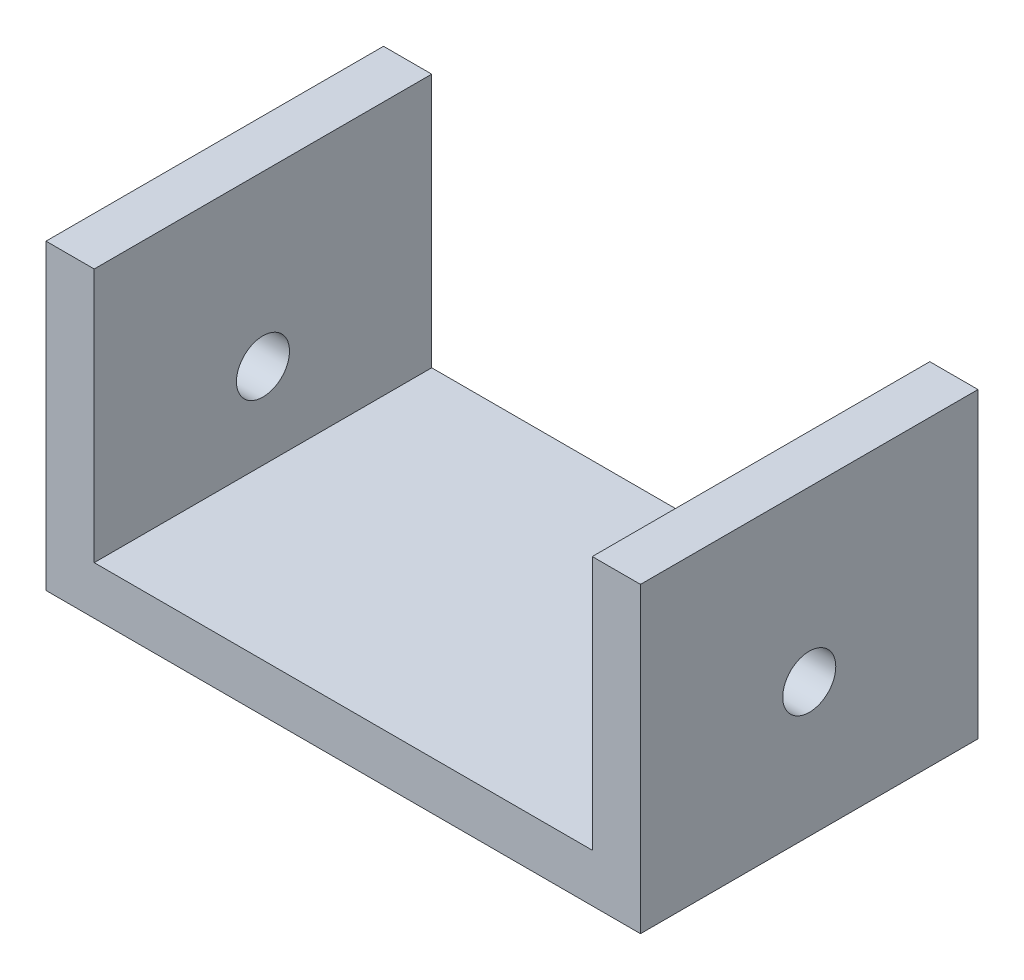
ISO-10303-21;
HEADER;
FILE_DESCRIPTION(('STEP AP214'),'2;1');
FILE_NAME('part.step','',(''),(''),'','','');
FILE_SCHEMA(('AUTOMOTIVE_DESIGN { 1 0 10303 214 1 1 1 1 }'));
ENDSEC;
DATA;
#1=APPLICATION_CONTEXT('core data for automotive mechanical design processes');
#2=APPLICATION_PROTOCOL_DEFINITION('international standard','automotive_design',2000,#1);
#3=PRODUCT_CONTEXT('',#1,'mechanical');
#4=PRODUCT('Part','Part','',(#3));
#5=PRODUCT_RELATED_PRODUCT_CATEGORY('part','',(#4));
#6=PRODUCT_DEFINITION_FORMATION('','',#4);
#7=PRODUCT_DEFINITION_CONTEXT('part definition',#1,'design');
#8=PRODUCT_DEFINITION('design','',#6,#7);
#9=PRODUCT_DEFINITION_SHAPE('','',#8);
#10=(LENGTH_UNIT() NAMED_UNIT(*) SI_UNIT(.MILLI.,.METRE.));
#11=(NAMED_UNIT(*) PLANE_ANGLE_UNIT() SI_UNIT($,.RADIAN.));
#12=(NAMED_UNIT(*) SI_UNIT($,.STERADIAN.) SOLID_ANGLE_UNIT());
#13=UNCERTAINTY_MEASURE_WITH_UNIT(LENGTH_MEASURE(1.E-05),#10,'distance_accuracy_value','');
#14=(GEOMETRIC_REPRESENTATION_CONTEXT(3) GLOBAL_UNCERTAINTY_ASSIGNED_CONTEXT((#13)) GLOBAL_UNIT_ASSIGNED_CONTEXT((#10,
#11,#12)) REPRESENTATION_CONTEXT('',''));
#15=CARTESIAN_POINT('',(0.,0.,0.));
#16=DIRECTION('',(0.,0.,1.));
#17=DIRECTION('',(1.,0.,0.));
#18=AXIS2_PLACEMENT_3D('',#15,#16,#17);
#19=CARTESIAN_POINT('',(-30.825,15.6875,35.));
#20=DIRECTION('',(0.,-1.,0.));
#21=DIRECTION('',(0.,0.,-1.));
#22=AXIS2_PLACEMENT_3D('',#19,#20,#21);
#23=PLANE('',#22);
#24=DIRECTION('',(-1.,0.,0.));
#25=VECTOR('',#24,1.);
#26=CARTESIAN_POINT('',(-30.825,15.6875,0.));
#27=LINE('',#26,#25);
#28=CARTESIAN_POINT('',(30.825,15.6875,0.));
#29=VERTEX_POINT('',#28);
#30=CARTESIAN_POINT('',(25.825,15.6875,0.));
#31=VERTEX_POINT('',#30);
#32=EDGE_CURVE('E179',#29,#31,#27,.T.);
#33=ORIENTED_EDGE('',*,*,#32,.T.);
#34=DIRECTION('',(0.,0.,-1.));
#35=VECTOR('',#34,1.);
#36=CARTESIAN_POINT('',(25.825,15.6875,35.));
#37=LINE('',#36,#35);
#38=CARTESIAN_POINT('',(25.825,15.6875,35.));
#39=VERTEX_POINT('',#38);
#40=EDGE_CURVE('E153',#39,#31,#37,.T.);
#41=ORIENTED_EDGE('',*,*,#40,.F.);
#42=DIRECTION('',(-1.,0.,0.));
#43=VECTOR('',#42,1.);
#44=CARTESIAN_POINT('',(-30.825,15.6875,35.));
#45=LINE('',#44,#43);
#46=CARTESIAN_POINT('',(30.825,15.6875,35.));
#47=VERTEX_POINT('',#46);
#48=EDGE_CURVE('E97',#47,#39,#45,.T.);
#49=ORIENTED_EDGE('',*,*,#48,.F.);
#50=DIRECTION('',(0.,0.,-1.));
#51=VECTOR('',#50,1.);
#52=CARTESIAN_POINT('',(30.825,15.6875,35.));
#53=LINE('',#52,#51);
#54=EDGE_CURVE('E11',#47,#29,#53,.T.);
#55=ORIENTED_EDGE('',*,*,#54,.T.);
#56=EDGE_LOOP('',(#33,#41,#49,#55));
#57=FACE_BOUND('',#56,.T.);
#58=ADVANCED_FACE('F43',(#57),#23,.F.);
#59=CARTESIAN_POINT('',(30.825,15.6875,35.));
#60=DIRECTION('',(-1.,0.,0.));
#61=DIRECTION('',(0.,0.,1.));
#62=AXIS2_PLACEMENT_3D('',#59,#60,#61);
#63=PLANE('',#62);
#64=CARTESIAN_POINT('',(30.825,-1.8125,17.5));
#65=DIRECTION('',(1.,0.,0.));
#66=DIRECTION('',(0.,0.,-1.));
#67=AXIS2_PLACEMENT_3D('',#64,#65,#66);
#68=CIRCLE('',#67,2.75);
#69=CARTESIAN_POINT('',(30.825,-1.8125,14.75));
#70=VERTEX_POINT('',#69);
#71=EDGE_CURVE('E344',#70,#70,#68,.T.);
#72=ORIENTED_EDGE('',*,*,#71,.F.);
#73=EDGE_LOOP('',(#72));
#74=FACE_BOUND('',#73,.T.);
#75=DIRECTION('',(0.,1.,0.));
#76=VECTOR('',#75,1.);
#77=CARTESIAN_POINT('',(30.825,15.6875,0.));
#78=LINE('',#77,#76);
#79=CARTESIAN_POINT('',(30.825,-15.6875,0.));
#80=VERTEX_POINT('',#79);
#81=EDGE_CURVE('E156',#80,#29,#78,.T.);
#82=ORIENTED_EDGE('',*,*,#81,.T.);
#83=ORIENTED_EDGE('',*,*,#54,.F.);
#84=DIRECTION('',(0.,1.,0.));
#85=VECTOR('',#84,1.);
#86=CARTESIAN_POINT('',(30.825,15.6875,35.));
#87=LINE('',#86,#85);
#88=CARTESIAN_POINT('',(30.825,-15.6875,35.));
#89=VERTEX_POINT('',#88);
#90=EDGE_CURVE('E163',#89,#47,#87,.T.);
#91=ORIENTED_EDGE('',*,*,#90,.F.);
#92=DIRECTION('',(0.,0.,-1.));
#93=VECTOR('',#92,1.);
#94=CARTESIAN_POINT('',(30.825,-15.6875,35.));
#95=LINE('',#94,#93);
#96=EDGE_CURVE('E174',#89,#80,#95,.T.);
#97=ORIENTED_EDGE('',*,*,#96,.T.);
#98=EDGE_LOOP('',(#82,#83,#91,#97));
#99=FACE_BOUND('',#98,.T.);
#100=ADVANCED_FACE('F45',(#74,#99),#63,.F.);
#101=CARTESIAN_POINT('',(-25.825,15.6875,35.));
#102=VERTEX_POINT('',#101);
#103=CARTESIAN_POINT('',(-30.825,15.6875,35.));
#104=VERTEX_POINT('',#103);
#105=EDGE_CURVE('E166',#102,#104,#45,.T.);
#106=ORIENTED_EDGE('',*,*,#105,.F.);
#107=DIRECTION('',(0.,0.,-1.));
#108=VECTOR('',#107,1.);
#109=CARTESIAN_POINT('',(-25.825,15.6875,35.));
#110=LINE('',#109,#108);
#111=CARTESIAN_POINT('',(-25.825,15.6875,0.));
#112=VERTEX_POINT('',#111);
#113=EDGE_CURVE('E157',#102,#112,#110,.T.);
#114=ORIENTED_EDGE('',*,*,#113,.T.);
#115=CARTESIAN_POINT('',(-30.825,15.6875,0.));
#116=VERTEX_POINT('',#115);
#117=EDGE_CURVE('E178',#112,#116,#27,.T.);
#118=ORIENTED_EDGE('',*,*,#117,.T.);
#119=DIRECTION('',(0.,0.,-1.));
#120=VECTOR('',#119,1.);
#121=CARTESIAN_POINT('',(-30.825,15.6875,35.));
#122=LINE('',#121,#120);
#123=EDGE_CURVE('E53',#104,#116,#122,.T.);
#124=ORIENTED_EDGE('',*,*,#123,.F.);
#125=EDGE_LOOP('',(#106,#114,#118,#124));
#126=FACE_BOUND('',#125,.T.);
#127=ADVANCED_FACE('F219',(#126),#23,.F.);
#128=CARTESIAN_POINT('',(-30.825,15.6875,35.));
#129=DIRECTION('',(1.,0.,0.));
#130=DIRECTION('',(0.,0.,-1.));
#131=AXIS2_PLACEMENT_3D('',#128,#129,#130);
#132=PLANE('',#131);
#133=CARTESIAN_POINT('',(-30.825,-1.8125,17.5));
#134=DIRECTION('',(1.,0.,0.));
#135=DIRECTION('',(0.,0.,-1.));
#136=AXIS2_PLACEMENT_3D('',#133,#134,#135);
#137=CIRCLE('',#136,2.75);
#138=CARTESIAN_POINT('',(-30.825,-1.8125,14.75));
#139=VERTEX_POINT('',#138);
#140=EDGE_CURVE('E349',#139,#139,#137,.T.);
#141=ORIENTED_EDGE('',*,*,#140,.T.);
#142=EDGE_LOOP('',(#141));
#143=FACE_BOUND('',#142,.T.);
#144=DIRECTION('',(0.,-1.,0.));
#145=VECTOR('',#144,1.);
#146=CARTESIAN_POINT('',(-30.825,15.6875,0.));
#147=LINE('',#146,#145);
#148=CARTESIAN_POINT('',(-30.825,-15.6875,0.));
#149=VERTEX_POINT('',#148);
#150=EDGE_CURVE('E183',#116,#149,#147,.T.);
#151=ORIENTED_EDGE('',*,*,#150,.T.);
#152=DIRECTION('',(0.,0.,-1.));
#153=VECTOR('',#152,1.);
#154=CARTESIAN_POINT('',(-30.825,-15.6875,35.));
#155=LINE('',#154,#153);
#156=CARTESIAN_POINT('',(-30.825,-15.6875,35.));
#157=VERTEX_POINT('',#156);
#158=EDGE_CURVE('E190',#157,#149,#155,.T.);
#159=ORIENTED_EDGE('',*,*,#158,.F.);
#160=DIRECTION('',(0.,-1.,0.));
#161=VECTOR('',#160,1.);
#162=CARTESIAN_POINT('',(-30.825,15.6875,35.));
#163=LINE('',#162,#161);
#164=EDGE_CURVE('E169',#104,#157,#163,.T.);
#165=ORIENTED_EDGE('',*,*,#164,.F.);
#166=ORIENTED_EDGE('',*,*,#123,.T.);
#167=EDGE_LOOP('',(#151,#159,#165,#166));
#168=FACE_BOUND('',#167,.T.);
#169=ADVANCED_FACE('F199',(#143,#168),#132,.F.);
#170=CARTESIAN_POINT('',(-30.825,-15.6875,35.));
#171=DIRECTION('',(0.,1.,0.));
#172=DIRECTION('',(0.,0.,1.));
#173=AXIS2_PLACEMENT_3D('',#170,#171,#172);
#174=PLANE('',#173);
#175=DIRECTION('',(1.,0.,0.));
#176=VECTOR('',#175,1.);
#177=CARTESIAN_POINT('',(-30.825,-15.6875,0.));
#178=LINE('',#177,#176);
#179=EDGE_CURVE('E90',#149,#80,#178,.T.);
#180=ORIENTED_EDGE('',*,*,#179,.T.);
#181=ORIENTED_EDGE('',*,*,#96,.F.);
#182=DIRECTION('',(1.,0.,0.));
#183=VECTOR('',#182,1.);
#184=CARTESIAN_POINT('',(-30.825,-15.6875,35.));
#185=LINE('',#184,#183);
#186=EDGE_CURVE('E69',#157,#89,#185,.T.);
#187=ORIENTED_EDGE('',*,*,#186,.F.);
#188=ORIENTED_EDGE('',*,*,#158,.T.);
#189=EDGE_LOOP('',(#180,#181,#187,#188));
#190=FACE_BOUND('',#189,.T.);
#191=ADVANCED_FACE('F211',(#190),#174,.F.);
#192=CARTESIAN_POINT('',(0.,0.,35.));
#193=DIRECTION('',(0.,0.,1.));
#194=DIRECTION('',(1.,0.,0.));
#195=AXIS2_PLACEMENT_3D('',#192,#193,#194);
#196=PLANE('',#195);
#197=DIRECTION('',(0.,-1.,0.));
#198=VECTOR('',#197,1.);
#199=CARTESIAN_POINT('',(25.825,15.6875,35.));
#200=LINE('',#199,#198);
#201=CARTESIAN_POINT('',(25.825,-10.6875,35.));
#202=VERTEX_POINT('',#201);
#203=EDGE_CURVE('E121',#39,#202,#200,.T.);
#204=ORIENTED_EDGE('',*,*,#203,.T.);
#205=DIRECTION('',(-1.,0.,0.));
#206=VECTOR('',#205,1.);
#207=CARTESIAN_POINT('',(25.825,-10.6875,35.));
#208=LINE('',#207,#206);
#209=CARTESIAN_POINT('',(-25.825,-10.6875,35.));
#210=VERTEX_POINT('',#209);
#211=EDGE_CURVE('E130',#202,#210,#208,.T.);
#212=ORIENTED_EDGE('',*,*,#211,.T.);
#213=DIRECTION('',(0.,1.,0.));
#214=VECTOR('',#213,1.);
#215=CARTESIAN_POINT('',(-25.825,15.6875,35.));
#216=LINE('',#215,#214);
#217=EDGE_CURVE('E127',#210,#102,#216,.T.);
#218=ORIENTED_EDGE('',*,*,#217,.T.);
#219=ORIENTED_EDGE('',*,*,#105,.T.);
#220=ORIENTED_EDGE('',*,*,#164,.T.);
#221=ORIENTED_EDGE('',*,*,#186,.T.);
#222=ORIENTED_EDGE('',*,*,#90,.T.);
#223=ORIENTED_EDGE('',*,*,#48,.T.);
#224=EDGE_LOOP('',(#204,#212,#218,#219,#220,#221,#222,#223));
#225=FACE_BOUND('',#224,.T.);
#226=ADVANCED_FACE('F136',(#225),#196,.T.);
#227=CARTESIAN_POINT('',(0.,0.,0.));
#228=DIRECTION('',(0.,0.,1.));
#229=DIRECTION('',(1.,0.,0.));
#230=AXIS2_PLACEMENT_3D('',#227,#228,#229);
#231=PLANE('',#230);
#232=DIRECTION('',(-1.,0.,0.));
#233=VECTOR('',#232,1.);
#234=CARTESIAN_POINT('',(25.825,-10.6875,0.));
#235=LINE('',#234,#233);
#236=CARTESIAN_POINT('',(25.825,-10.6875,0.));
#237=VERTEX_POINT('',#236);
#238=CARTESIAN_POINT('',(-25.825,-10.6875,0.));
#239=VERTEX_POINT('',#238);
#240=EDGE_CURVE('E141',#237,#239,#235,.T.);
#241=ORIENTED_EDGE('',*,*,#240,.F.);
#242=DIRECTION('',(0.,-1.,0.));
#243=VECTOR('',#242,1.);
#244=CARTESIAN_POINT('',(25.825,15.6875,0.));
#245=LINE('',#244,#243);
#246=EDGE_CURVE('E60',#31,#237,#245,.T.);
#247=ORIENTED_EDGE('',*,*,#246,.F.);
#248=ORIENTED_EDGE('',*,*,#32,.F.);
#249=ORIENTED_EDGE('',*,*,#81,.F.);
#250=ORIENTED_EDGE('',*,*,#179,.F.);
#251=ORIENTED_EDGE('',*,*,#150,.F.);
#252=ORIENTED_EDGE('',*,*,#117,.F.);
#253=DIRECTION('',(0.,1.,0.));
#254=VECTOR('',#253,1.);
#255=CARTESIAN_POINT('',(-25.825,15.6875,0.));
#256=LINE('',#255,#254);
#257=EDGE_CURVE('E138',#239,#112,#256,.T.);
#258=ORIENTED_EDGE('',*,*,#257,.F.);
#259=EDGE_LOOP('',(#241,#247,#248,#249,#250,#251,#252,#258));
#260=FACE_BOUND('',#259,.T.);
#261=ADVANCED_FACE('F205',(#260),#231,.F.);
#262=CARTESIAN_POINT('',(25.825,15.6875,35.));
#263=DIRECTION('',(1.,0.,0.));
#264=DIRECTION('',(0.,1.,0.));
#265=AXIS2_PLACEMENT_3D('',#262,#263,#264);
#266=PLANE('',#265);
#267=CARTESIAN_POINT('',(25.825,-1.8125,17.5));
#268=DIRECTION('',(1.,0.,0.));
#269=DIRECTION('',(0.,1.,0.));
#270=AXIS2_PLACEMENT_3D('',#267,#268,#269);
#271=CIRCLE('',#270,2.75);
#272=CARTESIAN_POINT('',(25.825,0.937499999999996,17.5));
#273=VERTEX_POINT('',#272);
#274=EDGE_CURVE('E144',#273,#273,#271,.T.);
#275=ORIENTED_EDGE('',*,*,#274,.T.);
#276=EDGE_LOOP('',(#275));
#277=FACE_BOUND('',#276,.T.);
#278=ORIENTED_EDGE('',*,*,#246,.T.);
#279=DIRECTION('',(0.,0.,-1.));
#280=VECTOR('',#279,1.);
#281=CARTESIAN_POINT('',(25.825,-10.6875,35.));
#282=LINE('',#281,#280);
#283=EDGE_CURVE('E117',#202,#237,#282,.T.);
#284=ORIENTED_EDGE('',*,*,#283,.F.);
#285=ORIENTED_EDGE('',*,*,#203,.F.);
#286=ORIENTED_EDGE('',*,*,#40,.T.);
#287=EDGE_LOOP('',(#278,#284,#285,#286));
#288=FACE_BOUND('',#287,.T.);
#289=ADVANCED_FACE('F119',(#277,#288),#266,.F.);
#290=CARTESIAN_POINT('',(-25.825,15.6875,35.));
#291=DIRECTION('',(-1.,0.,0.));
#292=DIRECTION('',(0.,0.,1.));
#293=AXIS2_PLACEMENT_3D('',#290,#291,#292);
#294=PLANE('',#293);
#295=CARTESIAN_POINT('',(-25.825,-1.8125,17.5));
#296=DIRECTION('',(-1.,0.,0.));
#297=DIRECTION('',(0.,0.,1.));
#298=AXIS2_PLACEMENT_3D('',#295,#296,#297);
#299=CIRCLE('',#298,2.75);
#300=CARTESIAN_POINT('',(-25.825,-1.8125,20.25));
#301=VERTEX_POINT('',#300);
#302=EDGE_CURVE('E47',#301,#301,#299,.T.);
#303=ORIENTED_EDGE('',*,*,#302,.T.);
#304=EDGE_LOOP('',(#303));
#305=FACE_BOUND('',#304,.T.);
#306=ORIENTED_EDGE('',*,*,#257,.T.);
#307=ORIENTED_EDGE('',*,*,#113,.F.);
#308=ORIENTED_EDGE('',*,*,#217,.F.);
#309=DIRECTION('',(0.,0.,-1.));
#310=VECTOR('',#309,1.);
#311=CARTESIAN_POINT('',(-25.825,-10.6875,35.));
#312=LINE('',#311,#310);
#313=EDGE_CURVE('E126',#210,#239,#312,.T.);
#314=ORIENTED_EDGE('',*,*,#313,.T.);
#315=EDGE_LOOP('',(#306,#307,#308,#314));
#316=FACE_BOUND('',#315,.T.);
#317=ADVANCED_FACE('F234',(#305,#316),#294,.F.);
#318=CARTESIAN_POINT('',(25.825,-10.6875,35.));
#319=DIRECTION('',(0.,-1.,0.));
#320=DIRECTION('',(0.,0.,-1.));
#321=AXIS2_PLACEMENT_3D('',#318,#319,#320);
#322=PLANE('',#321);
#323=ORIENTED_EDGE('',*,*,#240,.T.);
#324=ORIENTED_EDGE('',*,*,#313,.F.);
#325=ORIENTED_EDGE('',*,*,#211,.F.);
#326=ORIENTED_EDGE('',*,*,#283,.T.);
#327=EDGE_LOOP('',(#323,#324,#325,#326));
#328=FACE_BOUND('',#327,.T.);
#329=ADVANCED_FACE('F131',(#328),#322,.F.);
#330=CARTESIAN_POINT('',(-30.825,-1.8125,17.5));
#331=DIRECTION('',(1.,0.,0.));
#332=DIRECTION('',(0.,0.,-1.));
#333=AXIS2_PLACEMENT_3D('',#330,#331,#332);
#334=CYLINDRICAL_SURFACE('',#333,2.75);
#335=ORIENTED_EDGE('',*,*,#140,.F.);
#336=EDGE_LOOP('',(#335));
#337=FACE_BOUND('',#336,.T.);
#338=ORIENTED_EDGE('',*,*,#302,.F.);
#339=EDGE_LOOP('',(#338));
#340=FACE_BOUND('',#339,.T.);
#341=ADVANCED_FACE('F242',(#337,#340),#334,.F.);
#342=ORIENTED_EDGE('',*,*,#71,.T.);
#343=EDGE_LOOP('',(#342));
#344=FACE_BOUND('',#343,.T.);
#345=ORIENTED_EDGE('',*,*,#274,.F.);
#346=EDGE_LOOP('',(#345));
#347=FACE_BOUND('',#346,.T.);
#348=ADVANCED_FACE('F248',(#344,#347),#334,.F.);
#349=CLOSED_SHELL('',(#58,#100,#127,#169,#191,#226,#261,#289,#317,#329,#341,#348));
#350=MANIFOLD_SOLID_BREP('B2',#349);
#351=ADVANCED_BREP_SHAPE_REPRESENTATION('',(#18,#350),#14);
#352=SHAPE_DEFINITION_REPRESENTATION(#9,#351);
ENDSEC;
END-ISO-10303-21;
